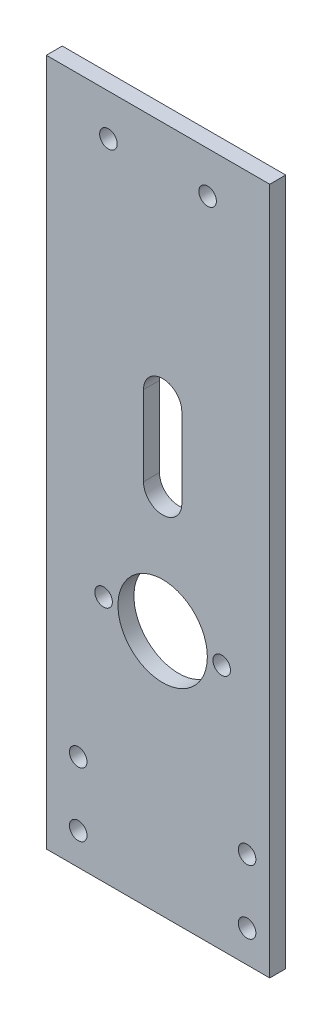
ISO-10303-21;
HEADER;
FILE_DESCRIPTION(('STEP AP214'),'2;1');
FILE_NAME('part.step','',(''),(''),'','','');
FILE_SCHEMA(('AUTOMOTIVE_DESIGN { 1 0 10303 214 1 1 1 1 }'));
ENDSEC;
DATA;
#1=APPLICATION_CONTEXT('core data for automotive mechanical design processes');
#2=APPLICATION_PROTOCOL_DEFINITION('international standard','automotive_design',2000,#1);
#3=PRODUCT_CONTEXT('',#1,'mechanical');
#4=PRODUCT('Part','Part','',(#3));
#5=PRODUCT_RELATED_PRODUCT_CATEGORY('part','',(#4));
#6=PRODUCT_DEFINITION_FORMATION('','',#4);
#7=PRODUCT_DEFINITION_CONTEXT('part definition',#1,'design');
#8=PRODUCT_DEFINITION('design','',#6,#7);
#9=PRODUCT_DEFINITION_SHAPE('','',#8);
#10=(LENGTH_UNIT() NAMED_UNIT(*) SI_UNIT(.MILLI.,.METRE.));
#11=(NAMED_UNIT(*) PLANE_ANGLE_UNIT() SI_UNIT($,.RADIAN.));
#12=(NAMED_UNIT(*) SI_UNIT($,.STERADIAN.) SOLID_ANGLE_UNIT());
#13=UNCERTAINTY_MEASURE_WITH_UNIT(LENGTH_MEASURE(1.E-05),#10,'distance_accuracy_value','');
#14=(GEOMETRIC_REPRESENTATION_CONTEXT(3) GLOBAL_UNCERTAINTY_ASSIGNED_CONTEXT((#13)) GLOBAL_UNIT_ASSIGNED_CONTEXT((#10,
#11,#12)) REPRESENTATION_CONTEXT('',''));
#15=CARTESIAN_POINT('',(0.,0.,0.));
#16=DIRECTION('',(0.,0.,1.));
#17=DIRECTION('',(1.,0.,0.));
#18=AXIS2_PLACEMENT_3D('',#15,#16,#17);
#19=CARTESIAN_POINT('',(-36.4504721681116,0.,5.));
#20=DIRECTION('',(-1.,0.,0.));
#21=DIRECTION('',(0.,0.,1.));
#22=AXIS2_PLACEMENT_3D('',#19,#20,#21);
#23=PLANE('',#22);
#24=DIRECTION('',(0.,1.,0.));
#25=VECTOR('',#24,1.);
#26=CARTESIAN_POINT('',(-36.4504721681116,0.,0.));
#27=LINE('',#26,#25);
#28=CARTESIAN_POINT('',(-36.4504721681116,-20.,0.));
#29=VERTEX_POINT('',#28);
#30=CARTESIAN_POINT('',(-36.4504721681116,195.356572125724,0.));
#31=VERTEX_POINT('',#30);
#32=EDGE_CURVE('E88',#29,#31,#27,.T.);
#33=ORIENTED_EDGE('',*,*,#32,.F.);
#34=DIRECTION('',(0.,0.,1.));
#35=VECTOR('',#34,1.);
#36=CARTESIAN_POINT('',(-36.4504721681116,-20.,-5.));
#37=LINE('',#36,#35);
#38=CARTESIAN_POINT('',(-36.4504721681116,-20.,5.));
#39=VERTEX_POINT('',#38);
#40=EDGE_CURVE('E52',#29,#39,#37,.T.);
#41=ORIENTED_EDGE('',*,*,#40,.T.);
#42=DIRECTION('',(0.,1.,0.));
#43=VECTOR('',#42,1.);
#44=CARTESIAN_POINT('',(-36.4504721681116,0.,5.));
#45=LINE('',#44,#43);
#46=CARTESIAN_POINT('',(-36.4504721681116,195.356572125724,5.));
#47=VERTEX_POINT('',#46);
#48=EDGE_CURVE('E60',#39,#47,#45,.T.);
#49=ORIENTED_EDGE('',*,*,#48,.T.);
#50=DIRECTION('',(0.,0.,-1.));
#51=VECTOR('',#50,1.);
#52=CARTESIAN_POINT('',(-36.4504721681116,195.356572125724,5.));
#53=LINE('',#52,#51);
#54=EDGE_CURVE('E159',#47,#31,#53,.T.);
#55=ORIENTED_EDGE('',*,*,#54,.T.);
#56=EDGE_LOOP('',(#33,#41,#49,#55));
#57=FACE_BOUND('',#56,.T.);
#58=ADVANCED_FACE('F38',(#57),#23,.T.);
#59=CARTESIAN_POINT('',(33.5495278318884,0.,5.));
#60=DIRECTION('',(-1.,0.,0.));
#61=DIRECTION('',(0.,0.,1.));
#62=AXIS2_PLACEMENT_3D('',#59,#60,#61);
#63=PLANE('',#62);
#64=DIRECTION('',(0.,0.,1.));
#65=VECTOR('',#64,1.);
#66=CARTESIAN_POINT('',(33.5495278318884,-20.,-5.));
#67=LINE('',#66,#65);
#68=CARTESIAN_POINT('',(33.5495278318884,-20.,0.));
#69=VERTEX_POINT('',#68);
#70=CARTESIAN_POINT('',(33.5495278318884,-20.,5.));
#71=VERTEX_POINT('',#70);
#72=EDGE_CURVE('E145',#69,#71,#67,.T.);
#73=ORIENTED_EDGE('',*,*,#72,.F.);
#74=DIRECTION('',(0.,1.,0.));
#75=VECTOR('',#74,1.);
#76=CARTESIAN_POINT('',(33.5495278318884,0.,0.));
#77=LINE('',#76,#75);
#78=CARTESIAN_POINT('',(33.5495278318884,195.356572125724,0.));
#79=VERTEX_POINT('',#78);
#80=EDGE_CURVE('E173',#69,#79,#77,.T.);
#81=ORIENTED_EDGE('',*,*,#80,.T.);
#82=DIRECTION('',(0.,0.,-1.));
#83=VECTOR('',#82,1.);
#84=CARTESIAN_POINT('',(33.5495278318884,195.356572125724,5.));
#85=LINE('',#84,#83);
#86=CARTESIAN_POINT('',(33.5495278318884,195.356572125724,5.));
#87=VERTEX_POINT('',#86);
#88=EDGE_CURVE('E161',#87,#79,#85,.T.);
#89=ORIENTED_EDGE('',*,*,#88,.F.);
#90=DIRECTION('',(0.,1.,0.));
#91=VECTOR('',#90,1.);
#92=CARTESIAN_POINT('',(33.5495278318884,0.,5.));
#93=LINE('',#92,#91);
#94=EDGE_CURVE('E46',#71,#87,#93,.T.);
#95=ORIENTED_EDGE('',*,*,#94,.F.);
#96=EDGE_LOOP('',(#73,#81,#89,#95));
#97=FACE_BOUND('',#96,.T.);
#98=ADVANCED_FACE('F217',(#97),#63,.F.);
#99=CARTESIAN_POINT('',(0.,0.,5.));
#100=DIRECTION('',(0.,0.,1.));
#101=DIRECTION('',(1.,0.,0.));
#102=AXIS2_PLACEMENT_3D('',#99,#100,#101);
#103=PLANE('',#102);
#104=CARTESIAN_POINT('',(0.,94.8565721257236,5.));
#105=DIRECTION('',(0.,0.,1.));
#106=DIRECTION('',(1.,0.,0.));
#107=AXIS2_PLACEMENT_3D('',#104,#105,#106);
#108=CIRCLE('',#107,6.);
#109=CARTESIAN_POINT('',(-5.99999999999999,94.8565721257236,5.));
#110=VERTEX_POINT('',#109);
#111=CARTESIAN_POINT('',(6.00000000000001,94.8565721257236,5.));
#112=VERTEX_POINT('',#111);
#113=EDGE_CURVE('E113',#110,#112,#108,.T.);
#114=ORIENTED_EDGE('',*,*,#113,.F.);
#115=DIRECTION('',(0.,-1.,0.));
#116=VECTOR('',#115,1.);
#117=CARTESIAN_POINT('',(-5.99999999999996,0.,5.));
#118=LINE('',#117,#116);
#119=CARTESIAN_POINT('',(-6.00000000000001,119.856572125724,5.));
#120=VERTEX_POINT('',#119);
#121=EDGE_CURVE('E129',#120,#110,#118,.T.);
#122=ORIENTED_EDGE('',*,*,#121,.F.);
#123=CARTESIAN_POINT('',(0.,119.856572125724,5.));
#124=DIRECTION('',(0.,0.,1.));
#125=DIRECTION('',(1.,0.,0.));
#126=AXIS2_PLACEMENT_3D('',#123,#124,#125);
#127=CIRCLE('',#126,6.);
#128=CARTESIAN_POINT('',(6.,119.856572125724,5.));
#129=VERTEX_POINT('',#128);
#130=EDGE_CURVE('E116',#129,#120,#127,.T.);
#131=ORIENTED_EDGE('',*,*,#130,.F.);
#132=DIRECTION('',(0.,-1.,0.));
#133=VECTOR('',#132,1.);
#134=CARTESIAN_POINT('',(6.00000000000003,0.,5.));
#135=LINE('',#134,#133);
#136=EDGE_CURVE('E108',#129,#112,#135,.T.);
#137=ORIENTED_EDGE('',*,*,#136,.T.);
#138=EDGE_LOOP('',(#114,#122,#131,#137));
#139=FACE_BOUND('',#138,.T.);
#140=CARTESIAN_POINT('',(-16.9918255464096,182.387739686011,5.));
#141=DIRECTION('',(0.,0.,1.));
#142=DIRECTION('',(1.,0.,0.));
#143=AXIS2_PLACEMENT_3D('',#140,#141,#142);
#144=CIRCLE('',#143,2.74999999999998);
#145=CARTESIAN_POINT('',(-14.2418255464096,182.387739686011,5.));
#146=VERTEX_POINT('',#145);
#147=EDGE_CURVE('E130',#146,#146,#144,.T.);
#148=ORIENTED_EDGE('',*,*,#147,.F.);
#149=EDGE_LOOP('',(#148));
#150=FACE_BOUND('',#149,.T.);
#151=CARTESIAN_POINT('',(14.090881210186,182.387739686011,5.));
#152=DIRECTION('',(0.,0.,1.));
#153=DIRECTION('',(1.,0.,0.));
#154=AXIS2_PLACEMENT_3D('',#151,#152,#153);
#155=CIRCLE('',#154,2.74999999999999);
#156=CARTESIAN_POINT('',(16.840881210186,182.387739686011,5.));
#157=VERTEX_POINT('',#156);
#158=EDGE_CURVE('E134',#157,#157,#155,.T.);
#159=ORIENTED_EDGE('',*,*,#158,.F.);
#160=EDGE_LOOP('',(#159));
#161=FACE_BOUND('',#160,.T.);
#162=CARTESIAN_POINT('',(-18.5,57.3565721257235,5.));
#163=DIRECTION('',(0.,0.,1.));
#164=DIRECTION('',(1.,0.,0.));
#165=AXIS2_PLACEMENT_3D('',#162,#163,#164);
#166=CIRCLE('',#165,2.75);
#167=CARTESIAN_POINT('',(-15.75,57.3565721257235,5.));
#168=VERTEX_POINT('',#167);
#169=EDGE_CURVE('E188',#168,#168,#166,.T.);
#170=ORIENTED_EDGE('',*,*,#169,.F.);
#171=EDGE_LOOP('',(#170));
#172=FACE_BOUND('',#171,.T.);
#173=CARTESIAN_POINT('',(18.5,57.3565721257235,5.));
#174=DIRECTION('',(0.,0.,1.));
#175=DIRECTION('',(1.,0.,0.));
#176=AXIS2_PLACEMENT_3D('',#173,#174,#175);
#177=CIRCLE('',#176,2.75);
#178=CARTESIAN_POINT('',(21.25,57.3565721257235,5.));
#179=VERTEX_POINT('',#178);
#180=EDGE_CURVE('E185',#179,#179,#177,.T.);
#181=ORIENTED_EDGE('',*,*,#180,.F.);
#182=EDGE_LOOP('',(#181));
#183=FACE_BOUND('',#182,.T.);
#184=CARTESIAN_POINT('',(-26.4504721681116,10.,5.));
#185=DIRECTION('',(0.,0.,1.));
#186=DIRECTION('',(1.,0.,0.));
#187=AXIS2_PLACEMENT_3D('',#184,#185,#186);
#188=CIRCLE('',#187,2.74999999999999);
#189=CARTESIAN_POINT('',(-23.7004721681116,10.,5.));
#190=VERTEX_POINT('',#189);
#191=EDGE_CURVE('E182',#190,#190,#188,.T.);
#192=ORIENTED_EDGE('',*,*,#191,.F.);
#193=EDGE_LOOP('',(#192));
#194=FACE_BOUND('',#193,.T.);
#195=CARTESIAN_POINT('',(26.4504721681116,10.,5.));
#196=DIRECTION('',(0.,0.,1.));
#197=DIRECTION('',(1.,0.,0.));
#198=AXIS2_PLACEMENT_3D('',#195,#196,#197);
#199=CIRCLE('',#198,2.75);
#200=CARTESIAN_POINT('',(29.2004721681116,10.,5.));
#201=VERTEX_POINT('',#200);
#202=EDGE_CURVE('E179',#201,#201,#199,.T.);
#203=ORIENTED_EDGE('',*,*,#202,.F.);
#204=EDGE_LOOP('',(#203));
#205=FACE_BOUND('',#204,.T.);
#206=CARTESIAN_POINT('',(26.4504721681116,-10.,5.));
#207=DIRECTION('',(0.,0.,1.));
#208=DIRECTION('',(1.,0.,0.));
#209=AXIS2_PLACEMENT_3D('',#206,#207,#208);
#210=CIRCLE('',#209,2.75);
#211=CARTESIAN_POINT('',(29.2004721681116,-10.,5.));
#212=VERTEX_POINT('',#211);
#213=EDGE_CURVE('E176',#212,#212,#210,.T.);
#214=ORIENTED_EDGE('',*,*,#213,.F.);
#215=EDGE_LOOP('',(#214));
#216=FACE_BOUND('',#215,.T.);
#217=CARTESIAN_POINT('',(-26.4504721681116,-10.,5.));
#218=DIRECTION('',(0.,0.,1.));
#219=DIRECTION('',(1.,0.,0.));
#220=AXIS2_PLACEMENT_3D('',#217,#218,#219);
#221=CIRCLE('',#220,2.74999999999999);
#222=CARTESIAN_POINT('',(-23.7004721681116,-10.,5.));
#223=VERTEX_POINT('',#222);
#224=EDGE_CURVE('E172',#223,#223,#221,.T.);
#225=ORIENTED_EDGE('',*,*,#224,.F.);
#226=EDGE_LOOP('',(#225));
#227=FACE_BOUND('',#226,.T.);
#228=CARTESIAN_POINT('',(0.,57.3565721257235,5.));
#229=DIRECTION('',(0.,0.,1.));
#230=DIRECTION('',(1.,0.,0.));
#231=AXIS2_PLACEMENT_3D('',#228,#229,#230);
#232=CIRCLE('',#231,14.);
#233=CARTESIAN_POINT('',(14.,57.3565721257235,5.));
#234=VERTEX_POINT('',#233);
#235=EDGE_CURVE('E169',#234,#234,#232,.T.);
#236=ORIENTED_EDGE('',*,*,#235,.F.);
#237=EDGE_LOOP('',(#236));
#238=FACE_BOUND('',#237,.T.);
#239=ORIENTED_EDGE('',*,*,#48,.F.);
#240=DIRECTION('',(1.,0.,0.));
#241=VECTOR('',#240,1.);
#242=CARTESIAN_POINT('',(0.,-20.,5.));
#243=LINE('',#242,#241);
#244=EDGE_CURVE('E280',#39,#71,#243,.T.);
#245=ORIENTED_EDGE('',*,*,#244,.T.);
#246=ORIENTED_EDGE('',*,*,#94,.T.);
#247=DIRECTION('',(1.,0.,0.));
#248=VECTOR('',#247,1.);
#249=CARTESIAN_POINT('',(0.,195.356572125724,5.));
#250=LINE('',#249,#248);
#251=EDGE_CURVE('E118',#47,#87,#250,.T.);
#252=ORIENTED_EDGE('',*,*,#251,.F.);
#253=EDGE_LOOP('',(#239,#245,#246,#252));
#254=FACE_BOUND('',#253,.T.);
#255=ADVANCED_FACE('F110',(#139,#150,#161,#172,#183,#194,#205,#216,#227,#238,#254),#103,.T.);
#256=CARTESIAN_POINT('',(0.,0.,0.));
#257=DIRECTION('',(0.,0.,1.));
#258=DIRECTION('',(1.,0.,0.));
#259=AXIS2_PLACEMENT_3D('',#256,#257,#258);
#260=PLANE('',#259);
#261=CARTESIAN_POINT('',(0.,94.8565721257236,0.));
#262=DIRECTION('',(0.,0.,1.));
#263=DIRECTION('',(1.,0.,0.));
#264=AXIS2_PLACEMENT_3D('',#261,#262,#263);
#265=CIRCLE('',#264,6.);
#266=CARTESIAN_POINT('',(-5.99999999999999,94.8565721257236,0.));
#267=VERTEX_POINT('',#266);
#268=CARTESIAN_POINT('',(6.00000000000001,94.8565721257236,0.));
#269=VERTEX_POINT('',#268);
#270=EDGE_CURVE('E148',#267,#269,#265,.T.);
#271=ORIENTED_EDGE('',*,*,#270,.T.);
#272=DIRECTION('',(0.,-1.,0.));
#273=VECTOR('',#272,1.);
#274=CARTESIAN_POINT('',(6.00000000000003,0.,0.));
#275=LINE('',#274,#273);
#276=CARTESIAN_POINT('',(6.,119.856572125724,0.));
#277=VERTEX_POINT('',#276);
#278=EDGE_CURVE('E124',#277,#269,#275,.T.);
#279=ORIENTED_EDGE('',*,*,#278,.F.);
#280=CARTESIAN_POINT('',(0.,119.856572125724,0.));
#281=DIRECTION('',(0.,0.,1.));
#282=DIRECTION('',(1.,0.,0.));
#283=AXIS2_PLACEMENT_3D('',#280,#281,#282);
#284=CIRCLE('',#283,6.);
#285=CARTESIAN_POINT('',(-6.00000000000001,119.856572125724,0.));
#286=VERTEX_POINT('',#285);
#287=EDGE_CURVE('E153',#277,#286,#284,.T.);
#288=ORIENTED_EDGE('',*,*,#287,.T.);
#289=DIRECTION('',(0.,-1.,0.));
#290=VECTOR('',#289,1.);
#291=CARTESIAN_POINT('',(-5.99999999999996,0.,0.));
#292=LINE('',#291,#290);
#293=EDGE_CURVE('E150',#286,#267,#292,.T.);
#294=ORIENTED_EDGE('',*,*,#293,.T.);
#295=EDGE_LOOP('',(#271,#279,#288,#294));
#296=FACE_BOUND('',#295,.T.);
#297=CARTESIAN_POINT('',(-16.9918255464096,182.387739686011,0.));
#298=DIRECTION('',(0.,0.,1.));
#299=DIRECTION('',(1.,0.,0.));
#300=AXIS2_PLACEMENT_3D('',#297,#298,#299);
#301=CIRCLE('',#300,2.74999999999998);
#302=CARTESIAN_POINT('',(-14.2418255464096,182.387739686011,0.));
#303=VERTEX_POINT('',#302);
#304=EDGE_CURVE('E144',#303,#303,#301,.T.);
#305=ORIENTED_EDGE('',*,*,#304,.T.);
#306=EDGE_LOOP('',(#305));
#307=FACE_BOUND('',#306,.T.);
#308=CARTESIAN_POINT('',(14.090881210186,182.387739686011,0.));
#309=DIRECTION('',(0.,0.,1.));
#310=DIRECTION('',(1.,0.,0.));
#311=AXIS2_PLACEMENT_3D('',#308,#309,#310);
#312=CIRCLE('',#311,2.74999999999999);
#313=CARTESIAN_POINT('',(16.840881210186,182.387739686011,0.));
#314=VERTEX_POINT('',#313);
#315=EDGE_CURVE('E141',#314,#314,#312,.T.);
#316=ORIENTED_EDGE('',*,*,#315,.T.);
#317=EDGE_LOOP('',(#316));
#318=FACE_BOUND('',#317,.T.);
#319=CARTESIAN_POINT('',(-18.5,57.3565721257235,0.));
#320=DIRECTION('',(0.,0.,1.));
#321=DIRECTION('',(1.,0.,0.));
#322=AXIS2_PLACEMENT_3D('',#319,#320,#321);
#323=CIRCLE('',#322,2.75);
#324=CARTESIAN_POINT('',(-15.75,57.3565721257235,0.));
#325=VERTEX_POINT('',#324);
#326=EDGE_CURVE('E210',#325,#325,#323,.T.);
#327=ORIENTED_EDGE('',*,*,#326,.T.);
#328=EDGE_LOOP('',(#327));
#329=FACE_BOUND('',#328,.T.);
#330=CARTESIAN_POINT('',(18.5,57.3565721257235,0.));
#331=DIRECTION('',(0.,0.,1.));
#332=DIRECTION('',(1.,0.,0.));
#333=AXIS2_PLACEMENT_3D('',#330,#331,#332);
#334=CIRCLE('',#333,2.75);
#335=CARTESIAN_POINT('',(21.25,57.3565721257235,0.));
#336=VERTEX_POINT('',#335);
#337=EDGE_CURVE('E207',#336,#336,#334,.T.);
#338=ORIENTED_EDGE('',*,*,#337,.T.);
#339=EDGE_LOOP('',(#338));
#340=FACE_BOUND('',#339,.T.);
#341=CARTESIAN_POINT('',(-26.4504721681116,10.,0.));
#342=DIRECTION('',(0.,0.,1.));
#343=DIRECTION('',(1.,0.,0.));
#344=AXIS2_PLACEMENT_3D('',#341,#342,#343);
#345=CIRCLE('',#344,2.74999999999999);
#346=CARTESIAN_POINT('',(-23.7004721681116,10.,0.));
#347=VERTEX_POINT('',#346);
#348=EDGE_CURVE('E204',#347,#347,#345,.T.);
#349=ORIENTED_EDGE('',*,*,#348,.T.);
#350=EDGE_LOOP('',(#349));
#351=FACE_BOUND('',#350,.T.);
#352=CARTESIAN_POINT('',(26.4504721681116,10.,0.));
#353=DIRECTION('',(0.,0.,1.));
#354=DIRECTION('',(1.,0.,0.));
#355=AXIS2_PLACEMENT_3D('',#352,#353,#354);
#356=CIRCLE('',#355,2.75);
#357=CARTESIAN_POINT('',(29.2004721681116,10.,0.));
#358=VERTEX_POINT('',#357);
#359=EDGE_CURVE('E201',#358,#358,#356,.T.);
#360=ORIENTED_EDGE('',*,*,#359,.T.);
#361=EDGE_LOOP('',(#360));
#362=FACE_BOUND('',#361,.T.);
#363=CARTESIAN_POINT('',(26.4504721681116,-10.,0.));
#364=DIRECTION('',(0.,0.,1.));
#365=DIRECTION('',(1.,0.,0.));
#366=AXIS2_PLACEMENT_3D('',#363,#364,#365);
#367=CIRCLE('',#366,2.75);
#368=CARTESIAN_POINT('',(29.2004721681116,-10.,0.));
#369=VERTEX_POINT('',#368);
#370=EDGE_CURVE('E198',#369,#369,#367,.T.);
#371=ORIENTED_EDGE('',*,*,#370,.T.);
#372=EDGE_LOOP('',(#371));
#373=FACE_BOUND('',#372,.T.);
#374=CARTESIAN_POINT('',(-26.4504721681116,-10.,0.));
#375=DIRECTION('',(0.,0.,1.));
#376=DIRECTION('',(1.,0.,0.));
#377=AXIS2_PLACEMENT_3D('',#374,#375,#376);
#378=CIRCLE('',#377,2.74999999999999);
#379=CARTESIAN_POINT('',(-23.7004721681116,-10.,0.));
#380=VERTEX_POINT('',#379);
#381=EDGE_CURVE('E195',#380,#380,#378,.T.);
#382=ORIENTED_EDGE('',*,*,#381,.T.);
#383=EDGE_LOOP('',(#382));
#384=FACE_BOUND('',#383,.T.);
#385=CARTESIAN_POINT('',(0.,57.3565721257235,0.));
#386=DIRECTION('',(0.,0.,1.));
#387=DIRECTION('',(1.,0.,0.));
#388=AXIS2_PLACEMENT_3D('',#385,#386,#387);
#389=CIRCLE('',#388,14.);
#390=CARTESIAN_POINT('',(14.,57.3565721257235,0.));
#391=VERTEX_POINT('',#390);
#392=EDGE_CURVE('E163',#391,#391,#389,.T.);
#393=ORIENTED_EDGE('',*,*,#392,.T.);
#394=EDGE_LOOP('',(#393));
#395=FACE_BOUND('',#394,.T.);
#396=DIRECTION('',(1.,0.,0.));
#397=VECTOR('',#396,1.);
#398=CARTESIAN_POINT('',(0.,-20.,0.));
#399=LINE('',#398,#397);
#400=EDGE_CURVE('E11',#29,#69,#399,.T.);
#401=ORIENTED_EDGE('',*,*,#400,.F.);
#402=ORIENTED_EDGE('',*,*,#32,.T.);
#403=DIRECTION('',(1.,0.,0.));
#404=VECTOR('',#403,1.);
#405=CARTESIAN_POINT('',(0.,195.356572125724,0.));
#406=LINE('',#405,#404);
#407=EDGE_CURVE('E157',#31,#79,#406,.T.);
#408=ORIENTED_EDGE('',*,*,#407,.T.);
#409=ORIENTED_EDGE('',*,*,#80,.F.);
#410=EDGE_LOOP('',(#401,#402,#408,#409));
#411=FACE_BOUND('',#410,.T.);
#412=ADVANCED_FACE('F224',(#296,#307,#318,#329,#340,#351,#362,#373,#384,#395,#411),#260,.F.);
#413=CARTESIAN_POINT('',(-18.5,57.3565721257235,5.));
#414=DIRECTION('',(0.,0.,-1.));
#415=DIRECTION('',(-1.,0.,0.));
#416=AXIS2_PLACEMENT_3D('',#413,#414,#415);
#417=CYLINDRICAL_SURFACE('',#416,2.75);
#418=ORIENTED_EDGE('',*,*,#169,.T.);
#419=EDGE_LOOP('',(#418));
#420=FACE_BOUND('',#419,.T.);
#421=ORIENTED_EDGE('',*,*,#326,.F.);
#422=EDGE_LOOP('',(#421));
#423=FACE_BOUND('',#422,.T.);
#424=ADVANCED_FACE('F226',(#420,#423),#417,.F.);
#425=CARTESIAN_POINT('',(18.5,57.3565721257235,5.));
#426=DIRECTION('',(0.,0.,-1.));
#427=DIRECTION('',(-1.,0.,0.));
#428=AXIS2_PLACEMENT_3D('',#425,#426,#427);
#429=CYLINDRICAL_SURFACE('',#428,2.75);
#430=ORIENTED_EDGE('',*,*,#180,.T.);
#431=EDGE_LOOP('',(#430));
#432=FACE_BOUND('',#431,.T.);
#433=ORIENTED_EDGE('',*,*,#337,.F.);
#434=EDGE_LOOP('',(#433));
#435=FACE_BOUND('',#434,.T.);
#436=ADVANCED_FACE('F233',(#432,#435),#429,.F.);
#437=CARTESIAN_POINT('',(-26.4504721681116,10.,5.));
#438=DIRECTION('',(0.,0.,-1.));
#439=DIRECTION('',(-1.,0.,0.));
#440=AXIS2_PLACEMENT_3D('',#437,#438,#439);
#441=CYLINDRICAL_SURFACE('',#440,2.74999999999999);
#442=ORIENTED_EDGE('',*,*,#191,.T.);
#443=EDGE_LOOP('',(#442));
#444=FACE_BOUND('',#443,.T.);
#445=ORIENTED_EDGE('',*,*,#348,.F.);
#446=EDGE_LOOP('',(#445));
#447=FACE_BOUND('',#446,.T.);
#448=ADVANCED_FACE('F247',(#444,#447),#441,.F.);
#449=CARTESIAN_POINT('',(26.4504721681116,10.,5.));
#450=DIRECTION('',(0.,0.,-1.));
#451=DIRECTION('',(-1.,0.,0.));
#452=AXIS2_PLACEMENT_3D('',#449,#450,#451);
#453=CYLINDRICAL_SURFACE('',#452,2.75);
#454=ORIENTED_EDGE('',*,*,#202,.T.);
#455=EDGE_LOOP('',(#454));
#456=FACE_BOUND('',#455,.T.);
#457=ORIENTED_EDGE('',*,*,#359,.F.);
#458=EDGE_LOOP('',(#457));
#459=FACE_BOUND('',#458,.T.);
#460=ADVANCED_FACE('F251',(#456,#459),#453,.F.);
#461=CARTESIAN_POINT('',(26.4504721681116,-10.,5.));
#462=DIRECTION('',(0.,0.,-1.));
#463=DIRECTION('',(-1.,0.,0.));
#464=AXIS2_PLACEMENT_3D('',#461,#462,#463);
#465=CYLINDRICAL_SURFACE('',#464,2.75);
#466=ORIENTED_EDGE('',*,*,#213,.T.);
#467=EDGE_LOOP('',(#466));
#468=FACE_BOUND('',#467,.T.);
#469=ORIENTED_EDGE('',*,*,#370,.F.);
#470=EDGE_LOOP('',(#469));
#471=FACE_BOUND('',#470,.T.);
#472=ADVANCED_FACE('F255',(#468,#471),#465,.F.);
#473=CARTESIAN_POINT('',(-26.4504721681116,-10.,5.));
#474=DIRECTION('',(0.,0.,-1.));
#475=DIRECTION('',(-1.,0.,0.));
#476=AXIS2_PLACEMENT_3D('',#473,#474,#475);
#477=CYLINDRICAL_SURFACE('',#476,2.74999999999999);
#478=ORIENTED_EDGE('',*,*,#224,.T.);
#479=EDGE_LOOP('',(#478));
#480=FACE_BOUND('',#479,.T.);
#481=ORIENTED_EDGE('',*,*,#381,.F.);
#482=EDGE_LOOP('',(#481));
#483=FACE_BOUND('',#482,.T.);
#484=ADVANCED_FACE('F258',(#480,#483),#477,.F.);
#485=CARTESIAN_POINT('',(0.,57.3565721257235,5.));
#486=DIRECTION('',(0.,0.,-1.));
#487=DIRECTION('',(-1.,0.,0.));
#488=AXIS2_PLACEMENT_3D('',#485,#486,#487);
#489=CYLINDRICAL_SURFACE('',#488,14.);
#490=ORIENTED_EDGE('',*,*,#235,.T.);
#491=EDGE_LOOP('',(#490));
#492=FACE_BOUND('',#491,.T.);
#493=ORIENTED_EDGE('',*,*,#392,.F.);
#494=EDGE_LOOP('',(#493));
#495=FACE_BOUND('',#494,.T.);
#496=ADVANCED_FACE('F40',(#492,#495),#489,.F.);
#497=CARTESIAN_POINT('',(0.,195.356572125724,5.));
#498=DIRECTION('',(0.,1.,0.));
#499=DIRECTION('',(0.,0.,1.));
#500=AXIS2_PLACEMENT_3D('',#497,#498,#499);
#501=PLANE('',#500);
#502=ORIENTED_EDGE('',*,*,#407,.F.);
#503=ORIENTED_EDGE('',*,*,#54,.F.);
#504=ORIENTED_EDGE('',*,*,#251,.T.);
#505=ORIENTED_EDGE('',*,*,#88,.T.);
#506=EDGE_LOOP('',(#502,#503,#504,#505));
#507=FACE_BOUND('',#506,.T.);
#508=ADVANCED_FACE('F222',(#507),#501,.T.);
#509=CARTESIAN_POINT('',(0.,94.8565721257236,5.));
#510=DIRECTION('',(0.,0.,-1.));
#511=DIRECTION('',(-1.,0.,0.));
#512=AXIS2_PLACEMENT_3D('',#509,#510,#511);
#513=CYLINDRICAL_SURFACE('',#512,6.);
#514=ORIENTED_EDGE('',*,*,#270,.F.);
#515=DIRECTION('',(0.,0.,-1.));
#516=VECTOR('',#515,1.);
#517=CARTESIAN_POINT('',(-5.99999999999999,94.8565721257236,5.));
#518=LINE('',#517,#516);
#519=EDGE_CURVE('E95',#110,#267,#518,.T.);
#520=ORIENTED_EDGE('',*,*,#519,.F.);
#521=ORIENTED_EDGE('',*,*,#113,.T.);
#522=DIRECTION('',(0.,0.,-1.));
#523=VECTOR('',#522,1.);
#524=CARTESIAN_POINT('',(6.00000000000001,94.8565721257236,5.));
#525=LINE('',#524,#523);
#526=EDGE_CURVE('E121',#112,#269,#525,.T.);
#527=ORIENTED_EDGE('',*,*,#526,.T.);
#528=EDGE_LOOP('',(#514,#520,#521,#527));
#529=FACE_BOUND('',#528,.T.);
#530=ADVANCED_FACE('F128',(#529),#513,.F.);
#531=CARTESIAN_POINT('',(-5.99999999999996,0.,5.));
#532=DIRECTION('',(1.,0.,0.));
#533=DIRECTION('',(0.,1.,0.));
#534=AXIS2_PLACEMENT_3D('',#531,#532,#533);
#535=PLANE('',#534);
#536=ORIENTED_EDGE('',*,*,#293,.F.);
#537=DIRECTION('',(0.,0.,-1.));
#538=VECTOR('',#537,1.);
#539=CARTESIAN_POINT('',(-6.00000000000001,119.856572125724,5.));
#540=LINE('',#539,#538);
#541=EDGE_CURVE('E166',#120,#286,#540,.T.);
#542=ORIENTED_EDGE('',*,*,#541,.F.);
#543=ORIENTED_EDGE('',*,*,#121,.T.);
#544=ORIENTED_EDGE('',*,*,#519,.T.);
#545=EDGE_LOOP('',(#536,#542,#543,#544));
#546=FACE_BOUND('',#545,.T.);
#547=ADVANCED_FACE('F300',(#546),#535,.T.);
#548=CARTESIAN_POINT('',(0.,119.856572125724,5.));
#549=DIRECTION('',(0.,0.,-1.));
#550=DIRECTION('',(-1.,0.,0.));
#551=AXIS2_PLACEMENT_3D('',#548,#549,#550);
#552=CYLINDRICAL_SURFACE('',#551,6.);
#553=ORIENTED_EDGE('',*,*,#287,.F.);
#554=DIRECTION('',(0.,0.,-1.));
#555=VECTOR('',#554,1.);
#556=CARTESIAN_POINT('',(6.,119.856572125724,5.));
#557=LINE('',#556,#555);
#558=EDGE_CURVE('E126',#129,#277,#557,.T.);
#559=ORIENTED_EDGE('',*,*,#558,.F.);
#560=ORIENTED_EDGE('',*,*,#130,.T.);
#561=ORIENTED_EDGE('',*,*,#541,.T.);
#562=EDGE_LOOP('',(#553,#559,#560,#561));
#563=FACE_BOUND('',#562,.T.);
#564=ADVANCED_FACE('F297',(#563),#552,.F.);
#565=CARTESIAN_POINT('',(6.00000000000003,0.,5.));
#566=DIRECTION('',(1.,0.,0.));
#567=DIRECTION('',(0.,1.,0.));
#568=AXIS2_PLACEMENT_3D('',#565,#566,#567);
#569=PLANE('',#568);
#570=ORIENTED_EDGE('',*,*,#278,.T.);
#571=ORIENTED_EDGE('',*,*,#526,.F.);
#572=ORIENTED_EDGE('',*,*,#136,.F.);
#573=ORIENTED_EDGE('',*,*,#558,.T.);
#574=EDGE_LOOP('',(#570,#571,#572,#573));
#575=FACE_BOUND('',#574,.T.);
#576=ADVANCED_FACE('F122',(#575),#569,.F.);
#577=CARTESIAN_POINT('',(-16.9918255464096,182.387739686011,5.));
#578=DIRECTION('',(0.,0.,-1.));
#579=DIRECTION('',(-1.,0.,0.));
#580=AXIS2_PLACEMENT_3D('',#577,#578,#579);
#581=CYLINDRICAL_SURFACE('',#580,2.74999999999998);
#582=ORIENTED_EDGE('',*,*,#147,.T.);
#583=EDGE_LOOP('',(#582));
#584=FACE_BOUND('',#583,.T.);
#585=ORIENTED_EDGE('',*,*,#304,.F.);
#586=EDGE_LOOP('',(#585));
#587=FACE_BOUND('',#586,.T.);
#588=ADVANCED_FACE('F289',(#584,#587),#581,.F.);
#589=CARTESIAN_POINT('',(14.090881210186,182.387739686011,5.));
#590=DIRECTION('',(0.,0.,-1.));
#591=DIRECTION('',(-1.,0.,0.));
#592=AXIS2_PLACEMENT_3D('',#589,#590,#591);
#593=CYLINDRICAL_SURFACE('',#592,2.74999999999999);
#594=ORIENTED_EDGE('',*,*,#158,.T.);
#595=EDGE_LOOP('',(#594));
#596=FACE_BOUND('',#595,.T.);
#597=ORIENTED_EDGE('',*,*,#315,.F.);
#598=EDGE_LOOP('',(#597));
#599=FACE_BOUND('',#598,.T.);
#600=ADVANCED_FACE('F284',(#596,#599),#593,.F.);
#601=CARTESIAN_POINT('',(0.,-20.,-5.));
#602=DIRECTION('',(0.,-1.,0.));
#603=DIRECTION('',(0.,0.,-1.));
#604=AXIS2_PLACEMENT_3D('',#601,#602,#603);
#605=PLANE('',#604);
#606=ORIENTED_EDGE('',*,*,#400,.T.);
#607=ORIENTED_EDGE('',*,*,#72,.T.);
#608=ORIENTED_EDGE('',*,*,#244,.F.);
#609=ORIENTED_EDGE('',*,*,#40,.F.);
#610=EDGE_LOOP('',(#606,#607,#608,#609));
#611=FACE_BOUND('',#610,.T.);
#612=ADVANCED_FACE('F282',(#611),#605,.T.);
#613=CLOSED_SHELL('',(#58,#98,#255,#412,#424,#436,#448,#460,#472,#484,#496,#508,#530,#547,#564,
#576,#588,#600,#612));
#614=MANIFOLD_SOLID_BREP('B2',#613);
#615=ADVANCED_BREP_SHAPE_REPRESENTATION('',(#18,#614),#14);
#616=SHAPE_DEFINITION_REPRESENTATION(#9,#615);
ENDSEC;
END-ISO-10303-21;
